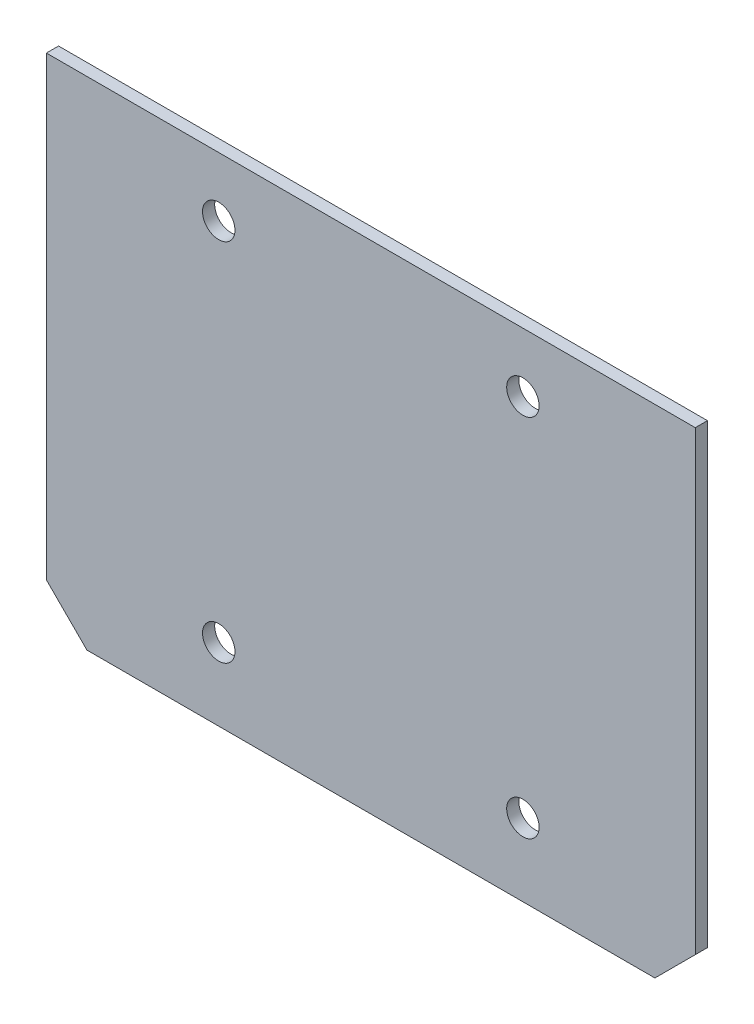
ISO-10303-21;
HEADER;
FILE_DESCRIPTION(('STEP AP214'),'2;1');
FILE_NAME('part.step','',(''),(''),'','','');
FILE_SCHEMA(('AUTOMOTIVE_DESIGN { 1 0 10303 214 1 1 1 1 }'));
ENDSEC;
DATA;
#1=APPLICATION_CONTEXT('core data for automotive mechanical design processes');
#2=APPLICATION_PROTOCOL_DEFINITION('international standard','automotive_design',2000,#1);
#3=PRODUCT_CONTEXT('',#1,'mechanical');
#4=PRODUCT('Part','Part','',(#3));
#5=PRODUCT_RELATED_PRODUCT_CATEGORY('part','',(#4));
#6=PRODUCT_DEFINITION_FORMATION('','',#4);
#7=PRODUCT_DEFINITION_CONTEXT('part definition',#1,'design');
#8=PRODUCT_DEFINITION('design','',#6,#7);
#9=PRODUCT_DEFINITION_SHAPE('','',#8);
#10=(LENGTH_UNIT() NAMED_UNIT(*) SI_UNIT(.MILLI.,.METRE.));
#11=(NAMED_UNIT(*) PLANE_ANGLE_UNIT() SI_UNIT($,.RADIAN.));
#12=(NAMED_UNIT(*) SI_UNIT($,.STERADIAN.) SOLID_ANGLE_UNIT());
#13=UNCERTAINTY_MEASURE_WITH_UNIT(LENGTH_MEASURE(1.E-05),#10,'distance_accuracy_value','');
#14=(GEOMETRIC_REPRESENTATION_CONTEXT(3) GLOBAL_UNCERTAINTY_ASSIGNED_CONTEXT((#13)) GLOBAL_UNIT_ASSIGNED_CONTEXT((#10,
#11,#12)) REPRESENTATION_CONTEXT('',''));
#15=CARTESIAN_POINT('',(0.,0.,0.));
#16=DIRECTION('',(0.,0.,1.));
#17=DIRECTION('',(1.,0.,0.));
#18=AXIS2_PLACEMENT_3D('',#15,#16,#17);
#19=CARTESIAN_POINT('',(0.,0.,11.0017851356166));
#20=DIRECTION('',(0.,0.,-1.));
#21=DIRECTION('',(-1.,0.,0.));
#22=AXIS2_PLACEMENT_3D('',#19,#20,#21);
#23=PLANE('',#22);
#24=DIRECTION('',(1.,0.,0.));
#25=VECTOR('',#24,1.);
#26=CARTESIAN_POINT('',(28.0174854270075,-37.4132178065151,11.0017851356166));
#27=LINE('',#26,#25);
#28=CARTESIAN_POINT('',(-27.9999999999999,-37.4132178065151,11.0017851356166));
#29=VERTEX_POINT('',#28);
#30=CARTESIAN_POINT('',(28.0174854270075,-37.4132178065151,11.0017851356166));
#31=VERTEX_POINT('',#30);
#32=EDGE_CURVE('E133',#29,#31,#27,.T.);
#33=ORIENTED_EDGE('',*,*,#32,.T.);
#34=DIRECTION('',(0.707106781186557,0.707106781186538,0.));
#35=VECTOR('',#34,1.);
#36=CARTESIAN_POINT('',(32.0174854270076,-33.4132178065151,11.0017851356166));
#37=LINE('',#36,#35);
#38=CARTESIAN_POINT('',(32.0174854270076,-33.4132178065151,11.0017851356166));
#39=VERTEX_POINT('',#38);
#40=EDGE_CURVE('E91',#31,#39,#37,.T.);
#41=ORIENTED_EDGE('',*,*,#40,.T.);
#42=DIRECTION('',(-0.000388565015279105,0.999999924508612,0.));
#43=VECTOR('',#42,1.);
#44=CARTESIAN_POINT('',(32.,11.5867821934849,11.0017851356166));
#45=LINE('',#44,#43);
#46=CARTESIAN_POINT('',(32.,11.5867821934849,11.0017851356166));
#47=VERTEX_POINT('',#46);
#48=EDGE_CURVE('E104',#39,#47,#45,.T.);
#49=ORIENTED_EDGE('',*,*,#48,.T.);
#50=DIRECTION('',(-1.,0.,0.));
#51=VECTOR('',#50,1.);
#52=CARTESIAN_POINT('',(-32.,11.5867821934849,11.0017851356166));
#53=LINE('',#52,#51);
#54=CARTESIAN_POINT('',(-32.,11.5867821934849,11.0017851356166));
#55=VERTEX_POINT('',#54);
#56=EDGE_CURVE('E98',#47,#55,#53,.T.);
#57=ORIENTED_EDGE('',*,*,#56,.T.);
#58=DIRECTION('',(0.,-1.,0.));
#59=VECTOR('',#58,1.);
#60=CARTESIAN_POINT('',(-32.,-33.4132178065151,11.0017851356166));
#61=LINE('',#60,#59);
#62=CARTESIAN_POINT('',(-32.,-33.4132178065151,11.0017851356166));
#63=VERTEX_POINT('',#62);
#64=EDGE_CURVE('E102',#55,#63,#61,.T.);
#65=ORIENTED_EDGE('',*,*,#64,.T.);
#66=DIRECTION('',(0.707106781186556,-0.707106781186539,0.));
#67=VECTOR('',#66,1.);
#68=CARTESIAN_POINT('',(-27.9999999999999,-37.4132178065151,11.0017851356166));
#69=LINE('',#68,#67);
#70=EDGE_CURVE('E54',#63,#29,#69,.T.);
#71=ORIENTED_EDGE('',*,*,#70,.T.);
#72=EDGE_LOOP('',(#33,#41,#49,#57,#65,#71));
#73=FACE_BOUND('',#72,.T.);
#74=CARTESIAN_POINT('',(-15.,5.74456922007627,11.0017851356166));
#75=DIRECTION('',(0.,0.,1.));
#76=DIRECTION('',(1.,0.,0.));
#77=AXIS2_PLACEMENT_3D('',#74,#75,#76);
#78=CIRCLE('',#77,1.6);
#79=CARTESIAN_POINT('',(-13.4,5.74456922007627,11.0017851356166));
#80=VERTEX_POINT('',#79);
#81=EDGE_CURVE('E126',#80,#80,#78,.T.);
#82=ORIENTED_EDGE('',*,*,#81,.F.);
#83=EDGE_LOOP('',(#82));
#84=FACE_BOUND('',#83,.T.);
#85=CARTESIAN_POINT('',(15.,5.74456922007628,11.0017851356166));
#86=DIRECTION('',(0.,0.,1.));
#87=DIRECTION('',(1.,0.,0.));
#88=AXIS2_PLACEMENT_3D('',#85,#86,#87);
#89=CIRCLE('',#88,1.6);
#90=CARTESIAN_POINT('',(16.6,5.74456922007628,11.0017851356166));
#91=VERTEX_POINT('',#90);
#92=EDGE_CURVE('E197',#91,#91,#89,.T.);
#93=ORIENTED_EDGE('',*,*,#92,.F.);
#94=EDGE_LOOP('',(#93));
#95=FACE_BOUND('',#94,.T.);
#96=CARTESIAN_POINT('',(-15.,-30.2554307799237,11.0017851356166));
#97=DIRECTION('',(0.,0.,1.));
#98=DIRECTION('',(1.,0.,0.));
#99=AXIS2_PLACEMENT_3D('',#96,#97,#98);
#100=CIRCLE('',#99,1.6);
#101=CARTESIAN_POINT('',(-13.4,-30.2554307799237,11.0017851356166));
#102=VERTEX_POINT('',#101);
#103=EDGE_CURVE('E191',#102,#102,#100,.T.);
#104=ORIENTED_EDGE('',*,*,#103,.F.);
#105=EDGE_LOOP('',(#104));
#106=FACE_BOUND('',#105,.T.);
#107=CARTESIAN_POINT('',(15.,-30.2554307799237,11.0017851356166));
#108=DIRECTION('',(0.,0.,1.));
#109=DIRECTION('',(1.,0.,0.));
#110=AXIS2_PLACEMENT_3D('',#107,#108,#109);
#111=CIRCLE('',#110,1.6);
#112=CARTESIAN_POINT('',(16.6,-30.2554307799237,11.0017851356166));
#113=VERTEX_POINT('',#112);
#114=EDGE_CURVE('E182',#113,#113,#111,.T.);
#115=ORIENTED_EDGE('',*,*,#114,.F.);
#116=EDGE_LOOP('',(#115));
#117=FACE_BOUND('',#116,.T.);
#118=ADVANCED_FACE('F37',(#73,#84,#95,#106,#117),#23,.F.);
#119=CARTESIAN_POINT('',(0.,0.,9.80178513561656));
#120=DIRECTION('',(0.,0.,-1.));
#121=DIRECTION('',(-1.,0.,0.));
#122=AXIS2_PLACEMENT_3D('',#119,#120,#121);
#123=PLANE('',#122);
#124=CARTESIAN_POINT('',(-15.,-30.2554307799237,9.80178513561656));
#125=DIRECTION('',(0.,0.,1.));
#126=DIRECTION('',(1.,0.,0.));
#127=AXIS2_PLACEMENT_3D('',#124,#125,#126);
#128=CIRCLE('',#127,1.6);
#129=CARTESIAN_POINT('',(-13.4,-30.2554307799237,9.80178513561656));
#130=VERTEX_POINT('',#129);
#131=EDGE_CURVE('E188',#130,#130,#128,.T.);
#132=ORIENTED_EDGE('',*,*,#131,.T.);
#133=EDGE_LOOP('',(#132));
#134=FACE_BOUND('',#133,.T.);
#135=CARTESIAN_POINT('',(-15.,5.74456922007627,9.80178513561656));
#136=DIRECTION('',(0.,0.,1.));
#137=DIRECTION('',(1.,0.,0.));
#138=AXIS2_PLACEMENT_3D('',#135,#136,#137);
#139=CIRCLE('',#138,1.6);
#140=CARTESIAN_POINT('',(-13.4,5.74456922007627,9.80178513561656));
#141=VERTEX_POINT('',#140);
#142=EDGE_CURVE('E200',#141,#141,#139,.T.);
#143=ORIENTED_EDGE('',*,*,#142,.T.);
#144=EDGE_LOOP('',(#143));
#145=FACE_BOUND('',#144,.T.);
#146=DIRECTION('',(1.,0.,0.));
#147=VECTOR('',#146,1.);
#148=CARTESIAN_POINT('',(28.0174854270075,-37.4132178065151,9.80178513561656));
#149=LINE('',#148,#147);
#150=CARTESIAN_POINT('',(-27.9999999999999,-37.4132178065151,9.80178513561656));
#151=VERTEX_POINT('',#150);
#152=CARTESIAN_POINT('',(28.0174854270075,-37.4132178065151,9.80178513561656));
#153=VERTEX_POINT('',#152);
#154=EDGE_CURVE('E122',#151,#153,#149,.T.);
#155=ORIENTED_EDGE('',*,*,#154,.F.);
#156=DIRECTION('',(0.707106781186556,-0.707106781186539,0.));
#157=VECTOR('',#156,1.);
#158=CARTESIAN_POINT('',(-27.9999999999999,-37.4132178065151,9.80178513561656));
#159=LINE('',#158,#157);
#160=CARTESIAN_POINT('',(-32.,-33.4132178065151,9.80178513561656));
#161=VERTEX_POINT('',#160);
#162=EDGE_CURVE('E83',#161,#151,#159,.T.);
#163=ORIENTED_EDGE('',*,*,#162,.F.);
#164=DIRECTION('',(0.,-1.,0.));
#165=VECTOR('',#164,1.);
#166=CARTESIAN_POINT('',(-32.,-33.4132178065151,9.80178513561656));
#167=LINE('',#166,#165);
#168=CARTESIAN_POINT('',(-32.,11.5867821934849,9.80178513561656));
#169=VERTEX_POINT('',#168);
#170=EDGE_CURVE('E77',#169,#161,#167,.T.);
#171=ORIENTED_EDGE('',*,*,#170,.F.);
#172=DIRECTION('',(-1.,0.,0.));
#173=VECTOR('',#172,1.);
#174=CARTESIAN_POINT('',(-32.,11.5867821934849,9.80178513561656));
#175=LINE('',#174,#173);
#176=CARTESIAN_POINT('',(32.,11.5867821934849,9.80178513561656));
#177=VERTEX_POINT('',#176);
#178=EDGE_CURVE('E112',#177,#169,#175,.T.);
#179=ORIENTED_EDGE('',*,*,#178,.F.);
#180=DIRECTION('',(-0.000388565015279105,0.999999924508612,0.));
#181=VECTOR('',#180,1.);
#182=CARTESIAN_POINT('',(32.,11.5867821934849,9.80178513561656));
#183=LINE('',#182,#181);
#184=CARTESIAN_POINT('',(32.0174854270076,-33.4132178065151,9.80178513561656));
#185=VERTEX_POINT('',#184);
#186=EDGE_CURVE('E128',#185,#177,#183,.T.);
#187=ORIENTED_EDGE('',*,*,#186,.F.);
#188=DIRECTION('',(0.707106781186557,0.707106781186538,0.));
#189=VECTOR('',#188,1.);
#190=CARTESIAN_POINT('',(32.0174854270076,-33.4132178065151,9.80178513561656));
#191=LINE('',#190,#189);
#192=EDGE_CURVE('E125',#153,#185,#191,.T.);
#193=ORIENTED_EDGE('',*,*,#192,.F.);
#194=EDGE_LOOP('',(#155,#163,#171,#179,#187,#193));
#195=FACE_BOUND('',#194,.T.);
#196=CARTESIAN_POINT('',(15.,5.74456922007628,9.80178513561656));
#197=DIRECTION('',(0.,0.,1.));
#198=DIRECTION('',(1.,0.,0.));
#199=AXIS2_PLACEMENT_3D('',#196,#197,#198);
#200=CIRCLE('',#199,1.6);
#201=CARTESIAN_POINT('',(16.6,5.74456922007628,9.80178513561656));
#202=VERTEX_POINT('',#201);
#203=EDGE_CURVE('E194',#202,#202,#200,.T.);
#204=ORIENTED_EDGE('',*,*,#203,.T.);
#205=EDGE_LOOP('',(#204));
#206=FACE_BOUND('',#205,.T.);
#207=CARTESIAN_POINT('',(15.,-30.2554307799237,9.80178513561656));
#208=DIRECTION('',(0.,0.,1.));
#209=DIRECTION('',(1.,0.,0.));
#210=AXIS2_PLACEMENT_3D('',#207,#208,#209);
#211=CIRCLE('',#210,1.6);
#212=CARTESIAN_POINT('',(16.6,-30.2554307799237,9.80178513561656));
#213=VERTEX_POINT('',#212);
#214=EDGE_CURVE('E185',#213,#213,#211,.T.);
#215=ORIENTED_EDGE('',*,*,#214,.T.);
#216=EDGE_LOOP('',(#215));
#217=FACE_BOUND('',#216,.T.);
#218=ADVANCED_FACE('F142',(#134,#145,#195,#206,#217),#123,.T.);
#219=CARTESIAN_POINT('',(28.0174854270075,-37.4132178065151,11.0017851356166));
#220=DIRECTION('',(0.,1.,0.));
#221=DIRECTION('',(0.,0.,1.));
#222=AXIS2_PLACEMENT_3D('',#219,#220,#221);
#223=PLANE('',#222);
#224=ORIENTED_EDGE('',*,*,#154,.T.);
#225=DIRECTION('',(0.,0.,-1.));
#226=VECTOR('',#225,1.);
#227=CARTESIAN_POINT('',(28.0174854270075,-37.4132178065151,11.0017851356166));
#228=LINE('',#227,#226);
#229=EDGE_CURVE('E11',#31,#153,#228,.T.);
#230=ORIENTED_EDGE('',*,*,#229,.F.);
#231=ORIENTED_EDGE('',*,*,#32,.F.);
#232=DIRECTION('',(0.,0.,-1.));
#233=VECTOR('',#232,1.);
#234=CARTESIAN_POINT('',(-27.9999999999999,-37.4132178065151,11.0017851356166));
#235=LINE('',#234,#233);
#236=EDGE_CURVE('E118',#29,#151,#235,.T.);
#237=ORIENTED_EDGE('',*,*,#236,.T.);
#238=EDGE_LOOP('',(#224,#230,#231,#237));
#239=FACE_BOUND('',#238,.T.);
#240=ADVANCED_FACE('F39',(#239),#223,.F.);
#241=CARTESIAN_POINT('',(32.0174854270076,-33.4132178065151,11.0017851356166));
#242=DIRECTION('',(-0.707106781186538,0.707106781186557,0.));
#243=DIRECTION('',(-0.707106781186557,-0.707106781186538,0.));
#244=AXIS2_PLACEMENT_3D('',#241,#242,#243);
#245=PLANE('',#244);
#246=ORIENTED_EDGE('',*,*,#192,.T.);
#247=DIRECTION('',(0.,0.,-1.));
#248=VECTOR('',#247,1.);
#249=CARTESIAN_POINT('',(32.0174854270076,-33.4132178065151,11.0017851356166));
#250=LINE('',#249,#248);
#251=EDGE_CURVE('E46',#39,#185,#250,.T.);
#252=ORIENTED_EDGE('',*,*,#251,.F.);
#253=ORIENTED_EDGE('',*,*,#40,.F.);
#254=ORIENTED_EDGE('',*,*,#229,.T.);
#255=EDGE_LOOP('',(#246,#252,#253,#254));
#256=FACE_BOUND('',#255,.T.);
#257=ADVANCED_FACE('F264',(#256),#245,.F.);
#258=CARTESIAN_POINT('',(32.,11.5867821934849,11.0017851356166));
#259=DIRECTION('',(-0.999999924508612,-0.000388565015279105,0.));
#260=DIRECTION('',(0.000388565015279105,-0.999999924508612,0.));
#261=AXIS2_PLACEMENT_3D('',#258,#259,#260);
#262=PLANE('',#261);
#263=ORIENTED_EDGE('',*,*,#186,.T.);
#264=DIRECTION('',(0.,0.,-1.));
#265=VECTOR('',#264,1.);
#266=CARTESIAN_POINT('',(32.,11.5867821934849,11.0017851356166));
#267=LINE('',#266,#265);
#268=EDGE_CURVE('E113',#47,#177,#267,.T.);
#269=ORIENTED_EDGE('',*,*,#268,.F.);
#270=ORIENTED_EDGE('',*,*,#48,.F.);
#271=ORIENTED_EDGE('',*,*,#251,.T.);
#272=EDGE_LOOP('',(#263,#269,#270,#271));
#273=FACE_BOUND('',#272,.T.);
#274=ADVANCED_FACE('F139',(#273),#262,.F.);
#275=CARTESIAN_POINT('',(-32.,11.5867821934849,11.0017851356166));
#276=DIRECTION('',(0.,-1.,0.));
#277=DIRECTION('',(0.,0.,-1.));
#278=AXIS2_PLACEMENT_3D('',#275,#276,#277);
#279=PLANE('',#278);
#280=ORIENTED_EDGE('',*,*,#178,.T.);
#281=DIRECTION('',(0.,0.,-1.));
#282=VECTOR('',#281,1.);
#283=CARTESIAN_POINT('',(-32.,11.5867821934849,11.0017851356166));
#284=LINE('',#283,#282);
#285=EDGE_CURVE('E109',#55,#169,#284,.T.);
#286=ORIENTED_EDGE('',*,*,#285,.F.);
#287=ORIENTED_EDGE('',*,*,#56,.F.);
#288=ORIENTED_EDGE('',*,*,#268,.T.);
#289=EDGE_LOOP('',(#280,#286,#287,#288));
#290=FACE_BOUND('',#289,.T.);
#291=ADVANCED_FACE('F110',(#290),#279,.F.);
#292=CARTESIAN_POINT('',(-32.,-33.4132178065151,11.0017851356166));
#293=DIRECTION('',(1.,0.,0.));
#294=DIRECTION('',(0.,0.,-1.));
#295=AXIS2_PLACEMENT_3D('',#292,#293,#294);
#296=PLANE('',#295);
#297=ORIENTED_EDGE('',*,*,#170,.T.);
#298=DIRECTION('',(0.,0.,-1.));
#299=VECTOR('',#298,1.);
#300=CARTESIAN_POINT('',(-32.,-33.4132178065151,11.0017851356166));
#301=LINE('',#300,#299);
#302=EDGE_CURVE('E114',#63,#161,#301,.T.);
#303=ORIENTED_EDGE('',*,*,#302,.F.);
#304=ORIENTED_EDGE('',*,*,#64,.F.);
#305=ORIENTED_EDGE('',*,*,#285,.T.);
#306=EDGE_LOOP('',(#297,#303,#304,#305));
#307=FACE_BOUND('',#306,.T.);
#308=ADVANCED_FACE('F116',(#307),#296,.F.);
#309=CARTESIAN_POINT('',(-27.9999999999999,-37.4132178065151,11.0017851356166));
#310=DIRECTION('',(0.707106781186539,0.707106781186556,0.));
#311=DIRECTION('',(-0.707106781186556,0.707106781186539,0.));
#312=AXIS2_PLACEMENT_3D('',#309,#310,#311);
#313=PLANE('',#312);
#314=ORIENTED_EDGE('',*,*,#162,.T.);
#315=ORIENTED_EDGE('',*,*,#236,.F.);
#316=ORIENTED_EDGE('',*,*,#70,.F.);
#317=ORIENTED_EDGE('',*,*,#302,.T.);
#318=EDGE_LOOP('',(#314,#315,#316,#317));
#319=FACE_BOUND('',#318,.T.);
#320=ADVANCED_FACE('F147',(#319),#313,.F.);
#321=CARTESIAN_POINT('',(-15.,5.74456922007627,11.0017851356166));
#322=DIRECTION('',(0.,0.,-1.));
#323=DIRECTION('',(-1.,0.,0.));
#324=AXIS2_PLACEMENT_3D('',#321,#322,#323);
#325=CYLINDRICAL_SURFACE('',#324,1.6);
#326=ORIENTED_EDGE('',*,*,#81,.T.);
#327=EDGE_LOOP('',(#326));
#328=FACE_BOUND('',#327,.T.);
#329=ORIENTED_EDGE('',*,*,#142,.F.);
#330=EDGE_LOOP('',(#329));
#331=FACE_BOUND('',#330,.T.);
#332=ADVANCED_FACE('F149',(#328,#331),#325,.F.);
#333=CARTESIAN_POINT('',(15.,5.74456922007628,11.0017851356166));
#334=DIRECTION('',(0.,0.,-1.));
#335=DIRECTION('',(-1.,0.,0.));
#336=AXIS2_PLACEMENT_3D('',#333,#334,#335);
#337=CYLINDRICAL_SURFACE('',#336,1.6);
#338=ORIENTED_EDGE('',*,*,#92,.T.);
#339=EDGE_LOOP('',(#338));
#340=FACE_BOUND('',#339,.T.);
#341=ORIENTED_EDGE('',*,*,#203,.F.);
#342=EDGE_LOOP('',(#341));
#343=FACE_BOUND('',#342,.T.);
#344=ADVANCED_FACE('F155',(#340,#343),#337,.F.);
#345=CARTESIAN_POINT('',(-15.,-30.2554307799237,11.0017851356166));
#346=DIRECTION('',(0.,0.,-1.));
#347=DIRECTION('',(-1.,0.,0.));
#348=AXIS2_PLACEMENT_3D('',#345,#346,#347);
#349=CYLINDRICAL_SURFACE('',#348,1.6);
#350=ORIENTED_EDGE('',*,*,#103,.T.);
#351=EDGE_LOOP('',(#350));
#352=FACE_BOUND('',#351,.T.);
#353=ORIENTED_EDGE('',*,*,#131,.F.);
#354=EDGE_LOOP('',(#353));
#355=FACE_BOUND('',#354,.T.);
#356=ADVANCED_FACE('F169',(#352,#355),#349,.F.);
#357=CARTESIAN_POINT('',(15.,-30.2554307799237,11.0017851356166));
#358=DIRECTION('',(0.,0.,-1.));
#359=DIRECTION('',(-1.,0.,0.));
#360=AXIS2_PLACEMENT_3D('',#357,#358,#359);
#361=CYLINDRICAL_SURFACE('',#360,1.6);
#362=ORIENTED_EDGE('',*,*,#114,.T.);
#363=EDGE_LOOP('',(#362));
#364=FACE_BOUND('',#363,.T.);
#365=ORIENTED_EDGE('',*,*,#214,.F.);
#366=EDGE_LOOP('',(#365));
#367=FACE_BOUND('',#366,.T.);
#368=ADVANCED_FACE('F173',(#364,#367),#361,.F.);
#369=CLOSED_SHELL('',(#118,#218,#240,#257,#274,#291,#308,#320,#332,#344,#356,#368));
#370=MANIFOLD_SOLID_BREP('B2',#369);
#371=ADVANCED_BREP_SHAPE_REPRESENTATION('',(#18,#370),#14);
#372=SHAPE_DEFINITION_REPRESENTATION(#9,#371);
ENDSEC;
END-ISO-10303-21;
